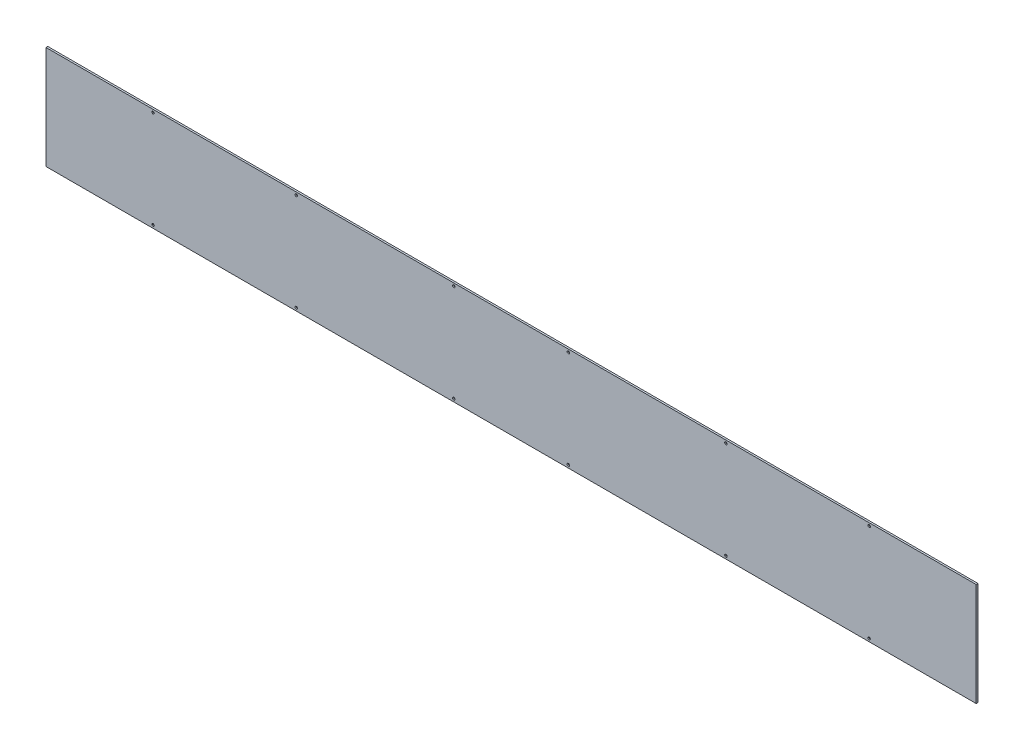
ISO-10303-21;
HEADER;
FILE_DESCRIPTION(('STEP AP214'),'2;1');
FILE_NAME('part.step','',(''),(''),'','','');
FILE_SCHEMA(('AUTOMOTIVE_DESIGN { 1 0 10303 214 1 1 1 1 }'));
ENDSEC;
DATA;
#1=APPLICATION_CONTEXT('core data for automotive mechanical design processes');
#2=APPLICATION_PROTOCOL_DEFINITION('international standard','automotive_design',2000,#1);
#3=PRODUCT_CONTEXT('',#1,'mechanical');
#4=PRODUCT('Part','Part','',(#3));
#5=PRODUCT_RELATED_PRODUCT_CATEGORY('part','',(#4));
#6=PRODUCT_DEFINITION_FORMATION('','',#4);
#7=PRODUCT_DEFINITION_CONTEXT('part definition',#1,'design');
#8=PRODUCT_DEFINITION('design','',#6,#7);
#9=PRODUCT_DEFINITION_SHAPE('','',#8);
#10=(LENGTH_UNIT() NAMED_UNIT(*) SI_UNIT(.MILLI.,.METRE.));
#11=(NAMED_UNIT(*) PLANE_ANGLE_UNIT() SI_UNIT($,.RADIAN.));
#12=(NAMED_UNIT(*) SI_UNIT($,.STERADIAN.) SOLID_ANGLE_UNIT());
#13=UNCERTAINTY_MEASURE_WITH_UNIT(LENGTH_MEASURE(1.E-05),#10,'distance_accuracy_value','');
#14=(GEOMETRIC_REPRESENTATION_CONTEXT(3) GLOBAL_UNCERTAINTY_ASSIGNED_CONTEXT((#13)) GLOBAL_UNIT_ASSIGNED_CONTEXT((#10,
#11,#12)) REPRESENTATION_CONTEXT('',''));
#15=CARTESIAN_POINT('',(0.,0.,0.));
#16=DIRECTION('',(0.,0.,1.));
#17=DIRECTION('',(1.,0.,0.));
#18=AXIS2_PLACEMENT_3D('',#15,#16,#17);
#19=CARTESIAN_POINT('',(-3247.5,0.,12.7));
#20=DIRECTION('',(1.,0.,0.));
#21=DIRECTION('',(0.,0.,-1.));
#22=AXIS2_PLACEMENT_3D('',#19,#20,#21);
#23=PLANE('',#22);
#24=DIRECTION('',(0.,-1.,0.));
#25=VECTOR('',#24,1.);
#26=CARTESIAN_POINT('',(-3247.5,0.,0.));
#27=LINE('',#26,#25);
#28=CARTESIAN_POINT('',(-3247.5,360.,0.));
#29=VERTEX_POINT('',#28);
#30=CARTESIAN_POINT('',(-3247.5,-360.,0.));
#31=VERTEX_POINT('',#30);
#32=EDGE_CURVE('E101',#29,#31,#27,.T.);
#33=ORIENTED_EDGE('',*,*,#32,.T.);
#34=DIRECTION('',(0.,0.,-1.));
#35=VECTOR('',#34,1.);
#36=CARTESIAN_POINT('',(-3247.5,-360.,12.7));
#37=LINE('',#36,#35);
#38=CARTESIAN_POINT('',(-3247.5,-360.,12.7));
#39=VERTEX_POINT('',#38);
#40=EDGE_CURVE('E11',#39,#31,#37,.T.);
#41=ORIENTED_EDGE('',*,*,#40,.F.);
#42=DIRECTION('',(0.,-1.,0.));
#43=VECTOR('',#42,1.);
#44=CARTESIAN_POINT('',(-3247.5,0.,12.7));
#45=LINE('',#44,#43);
#46=CARTESIAN_POINT('',(-3247.5,360.,12.7));
#47=VERTEX_POINT('',#46);
#48=EDGE_CURVE('E88',#47,#39,#45,.T.);
#49=ORIENTED_EDGE('',*,*,#48,.F.);
#50=DIRECTION('',(0.,0.,-1.));
#51=VECTOR('',#50,1.);
#52=CARTESIAN_POINT('',(-3247.5,360.,12.7));
#53=LINE('',#52,#51);
#54=EDGE_CURVE('E97',#47,#29,#53,.T.);
#55=ORIENTED_EDGE('',*,*,#54,.T.);
#56=EDGE_LOOP('',(#33,#41,#49,#55));
#57=FACE_BOUND('',#56,.T.);
#58=ADVANCED_FACE('F35',(#57),#23,.F.);
#59=CARTESIAN_POINT('',(0.,-360.,12.7));
#60=DIRECTION('',(0.,1.,0.));
#61=DIRECTION('',(-1.,0.,0.));
#62=AXIS2_PLACEMENT_3D('',#59,#60,#61);
#63=PLANE('',#62);
#64=DIRECTION('',(1.,0.,0.));
#65=VECTOR('',#64,1.);
#66=CARTESIAN_POINT('',(0.,-360.,0.));
#67=LINE('',#66,#65);
#68=CARTESIAN_POINT('',(3247.5,-359.999999999999,0.));
#69=VERTEX_POINT('',#68);
#70=EDGE_CURVE('E92',#31,#69,#67,.T.);
#71=ORIENTED_EDGE('',*,*,#70,.T.);
#72=DIRECTION('',(0.,0.,-1.));
#73=VECTOR('',#72,1.);
#74=CARTESIAN_POINT('',(3247.5,-359.999999999999,12.7));
#75=LINE('',#74,#73);
#76=CARTESIAN_POINT('',(3247.5,-359.999999999999,12.7));
#77=VERTEX_POINT('',#76);
#78=EDGE_CURVE('E44',#77,#69,#75,.T.);
#79=ORIENTED_EDGE('',*,*,#78,.F.);
#80=DIRECTION('',(1.,0.,0.));
#81=VECTOR('',#80,1.);
#82=CARTESIAN_POINT('',(0.,-360.,12.7));
#83=LINE('',#82,#81);
#84=EDGE_CURVE('E83',#39,#77,#83,.T.);
#85=ORIENTED_EDGE('',*,*,#84,.F.);
#86=ORIENTED_EDGE('',*,*,#40,.T.);
#87=EDGE_LOOP('',(#71,#79,#85,#86));
#88=FACE_BOUND('',#87,.T.);
#89=ADVANCED_FACE('F91',(#88),#63,.F.);
#90=CARTESIAN_POINT('',(3247.5,0.,12.7));
#91=DIRECTION('',(-1.,0.,0.));
#92=DIRECTION('',(0.,0.,1.));
#93=AXIS2_PLACEMENT_3D('',#90,#91,#92);
#94=PLANE('',#93);
#95=DIRECTION('',(0.,1.,0.));
#96=VECTOR('',#95,1.);
#97=CARTESIAN_POINT('',(3247.5,0.,0.));
#98=LINE('',#97,#96);
#99=CARTESIAN_POINT('',(3247.5,359.999999999999,0.));
#100=VERTEX_POINT('',#99);
#101=EDGE_CURVE('E70',#69,#100,#98,.T.);
#102=ORIENTED_EDGE('',*,*,#101,.T.);
#103=DIRECTION('',(0.,0.,-1.));
#104=VECTOR('',#103,1.);
#105=CARTESIAN_POINT('',(3247.5,359.999999999999,12.7));
#106=LINE('',#105,#104);
#107=CARTESIAN_POINT('',(3247.5,359.999999999999,12.7));
#108=VERTEX_POINT('',#107);
#109=EDGE_CURVE('E93',#108,#100,#106,.T.);
#110=ORIENTED_EDGE('',*,*,#109,.F.);
#111=DIRECTION('',(0.,1.,0.));
#112=VECTOR('',#111,1.);
#113=CARTESIAN_POINT('',(3247.5,0.,12.7));
#114=LINE('',#113,#112);
#115=EDGE_CURVE('E86',#77,#108,#114,.T.);
#116=ORIENTED_EDGE('',*,*,#115,.F.);
#117=ORIENTED_EDGE('',*,*,#78,.T.);
#118=EDGE_LOOP('',(#102,#110,#116,#117));
#119=FACE_BOUND('',#118,.T.);
#120=ADVANCED_FACE('F95',(#119),#94,.F.);
#121=CARTESIAN_POINT('',(0.,360.,12.7));
#122=DIRECTION('',(0.,-1.,0.));
#123=DIRECTION('',(1.,0.,0.));
#124=AXIS2_PLACEMENT_3D('',#121,#122,#123);
#125=PLANE('',#124);
#126=DIRECTION('',(-1.,0.,0.));
#127=VECTOR('',#126,1.);
#128=CARTESIAN_POINT('',(0.,360.,0.));
#129=LINE('',#128,#127);
#130=EDGE_CURVE('E76',#100,#29,#129,.T.);
#131=ORIENTED_EDGE('',*,*,#130,.T.);
#132=ORIENTED_EDGE('',*,*,#54,.F.);
#133=DIRECTION('',(-1.,0.,0.));
#134=VECTOR('',#133,1.);
#135=CARTESIAN_POINT('',(0.,360.,12.7));
#136=LINE('',#135,#134);
#137=EDGE_CURVE('E53',#108,#47,#136,.T.);
#138=ORIENTED_EDGE('',*,*,#137,.F.);
#139=ORIENTED_EDGE('',*,*,#109,.T.);
#140=EDGE_LOOP('',(#131,#132,#138,#139));
#141=FACE_BOUND('',#140,.T.);
#142=ADVANCED_FACE('F225',(#141),#125,.F.);
#143=CARTESIAN_POINT('',(0.,0.,12.7));
#144=DIRECTION('',(0.,0.,1.));
#145=DIRECTION('',(1.,0.,0.));
#146=AXIS2_PLACEMENT_3D('',#143,#144,#145);
#147=PLANE('',#146);
#148=CARTESIAN_POINT('',(-2500.,339.999999999999,12.7));
#149=DIRECTION('',(0.,0.,1.));
#150=DIRECTION('',(1.,0.,0.));
#151=AXIS2_PLACEMENT_3D('',#148,#149,#150);
#152=CIRCLE('',#151,8.64999999999982);
#153=CARTESIAN_POINT('',(-2491.35,339.999999999999,12.7));
#154=VERTEX_POINT('',#153);
#155=EDGE_CURVE('E503',#154,#154,#152,.T.);
#156=ORIENTED_EDGE('',*,*,#155,.F.);
#157=EDGE_LOOP('',(#156));
#158=FACE_BOUND('',#157,.T.);
#159=CARTESIAN_POINT('',(-1500.,339.999999999999,12.7));
#160=DIRECTION('',(0.,0.,1.));
#161=DIRECTION('',(1.,0.,0.));
#162=AXIS2_PLACEMENT_3D('',#159,#160,#161);
#163=CIRCLE('',#162,8.65000000000005);
#164=CARTESIAN_POINT('',(-1491.35,339.999999999999,12.7));
#165=VERTEX_POINT('',#164);
#166=EDGE_CURVE('E166',#165,#165,#163,.T.);
#167=ORIENTED_EDGE('',*,*,#166,.F.);
#168=EDGE_LOOP('',(#167));
#169=FACE_BOUND('',#168,.T.);
#170=CARTESIAN_POINT('',(400.,339.999999999999,12.7));
#171=DIRECTION('',(0.,0.,1.));
#172=DIRECTION('',(1.,0.,0.));
#173=AXIS2_PLACEMENT_3D('',#170,#171,#172);
#174=CIRCLE('',#173,8.64999999999999);
#175=CARTESIAN_POINT('',(408.65,339.999999999999,12.7));
#176=VERTEX_POINT('',#175);
#177=EDGE_CURVE('E159',#176,#176,#174,.T.);
#178=ORIENTED_EDGE('',*,*,#177,.F.);
#179=EDGE_LOOP('',(#178));
#180=FACE_BOUND('',#179,.T.);
#181=CARTESIAN_POINT('',(1500.,339.999999999999,12.7));
#182=DIRECTION('',(0.,0.,1.));
#183=DIRECTION('',(1.,0.,0.));
#184=AXIS2_PLACEMENT_3D('',#181,#182,#183);
#185=CIRCLE('',#184,8.65000000000005);
#186=CARTESIAN_POINT('',(1508.65,339.999999999999,12.7));
#187=VERTEX_POINT('',#186);
#188=EDGE_CURVE('E155',#187,#187,#185,.T.);
#189=ORIENTED_EDGE('',*,*,#188,.F.);
#190=EDGE_LOOP('',(#189));
#191=FACE_BOUND('',#190,.T.);
#192=CARTESIAN_POINT('',(2500.,339.999999999999,12.7));
#193=DIRECTION('',(0.,0.,1.));
#194=DIRECTION('',(1.,0.,0.));
#195=AXIS2_PLACEMENT_3D('',#192,#193,#194);
#196=CIRCLE('',#195,8.64999999999982);
#197=CARTESIAN_POINT('',(2508.65,339.999999999999,12.7));
#198=VERTEX_POINT('',#197);
#199=EDGE_CURVE('E151',#198,#198,#196,.T.);
#200=ORIENTED_EDGE('',*,*,#199,.F.);
#201=EDGE_LOOP('',(#200));
#202=FACE_BOUND('',#201,.T.);
#203=CARTESIAN_POINT('',(2500.,-340.,12.7));
#204=DIRECTION('',(0.,0.,1.));
#205=DIRECTION('',(1.,0.,0.));
#206=AXIS2_PLACEMENT_3D('',#203,#204,#205);
#207=CIRCLE('',#206,8.64999999999982);
#208=CARTESIAN_POINT('',(2508.65,-340.,12.7));
#209=VERTEX_POINT('',#208);
#210=EDGE_CURVE('E146',#209,#209,#207,.T.);
#211=ORIENTED_EDGE('',*,*,#210,.F.);
#212=EDGE_LOOP('',(#211));
#213=FACE_BOUND('',#212,.T.);
#214=CARTESIAN_POINT('',(1500.,-340.,12.7));
#215=DIRECTION('',(0.,0.,1.));
#216=DIRECTION('',(1.,0.,0.));
#217=AXIS2_PLACEMENT_3D('',#214,#215,#216);
#218=CIRCLE('',#217,8.65000000000005);
#219=CARTESIAN_POINT('',(1508.65,-340.,12.7));
#220=VERTEX_POINT('',#219);
#221=EDGE_CURVE('E141',#220,#220,#218,.T.);
#222=ORIENTED_EDGE('',*,*,#221,.F.);
#223=EDGE_LOOP('',(#222));
#224=FACE_BOUND('',#223,.T.);
#225=CARTESIAN_POINT('',(400.,-340.,12.7));
#226=DIRECTION('',(0.,0.,1.));
#227=DIRECTION('',(1.,0.,0.));
#228=AXIS2_PLACEMENT_3D('',#225,#226,#227);
#229=CIRCLE('',#228,8.64999999999999);
#230=CARTESIAN_POINT('',(408.65,-340.,12.7));
#231=VERTEX_POINT('',#230);
#232=EDGE_CURVE('E136',#231,#231,#229,.T.);
#233=ORIENTED_EDGE('',*,*,#232,.F.);
#234=EDGE_LOOP('',(#233));
#235=FACE_BOUND('',#234,.T.);
#236=CARTESIAN_POINT('',(-1500.,-340.,12.7));
#237=DIRECTION('',(0.,0.,1.));
#238=DIRECTION('',(1.,0.,0.));
#239=AXIS2_PLACEMENT_3D('',#236,#237,#238);
#240=CIRCLE('',#239,8.65000000000005);
#241=CARTESIAN_POINT('',(-1491.35,-340.,12.7));
#242=VERTEX_POINT('',#241);
#243=EDGE_CURVE('E131',#242,#242,#240,.T.);
#244=ORIENTED_EDGE('',*,*,#243,.F.);
#245=EDGE_LOOP('',(#244));
#246=FACE_BOUND('',#245,.T.);
#247=CARTESIAN_POINT('',(-2500.,-340.,12.7));
#248=DIRECTION('',(0.,0.,1.));
#249=DIRECTION('',(1.,0.,0.));
#250=AXIS2_PLACEMENT_3D('',#247,#248,#249);
#251=CIRCLE('',#250,8.64999999999982);
#252=CARTESIAN_POINT('',(-2491.35,-340.,12.7));
#253=VERTEX_POINT('',#252);
#254=EDGE_CURVE('E126',#253,#253,#251,.T.);
#255=ORIENTED_EDGE('',*,*,#254,.F.);
#256=EDGE_LOOP('',(#255));
#257=FACE_BOUND('',#256,.T.);
#258=CARTESIAN_POINT('',(-400.,339.999999999999,12.7));
#259=DIRECTION('',(0.,0.,1.));
#260=DIRECTION('',(1.,0.,0.));
#261=AXIS2_PLACEMENT_3D('',#258,#259,#260);
#262=CIRCLE('',#261,8.64999999999999);
#263=CARTESIAN_POINT('',(-391.35,339.999999999999,12.7));
#264=VERTEX_POINT('',#263);
#265=EDGE_CURVE('E121',#264,#264,#262,.T.);
#266=ORIENTED_EDGE('',*,*,#265,.F.);
#267=EDGE_LOOP('',(#266));
#268=FACE_BOUND('',#267,.T.);
#269=CARTESIAN_POINT('',(-400.,-340.,12.7));
#270=DIRECTION('',(0.,0.,1.));
#271=DIRECTION('',(1.,0.,0.));
#272=AXIS2_PLACEMENT_3D('',#269,#270,#271);
#273=CIRCLE('',#272,8.64999999999999);
#274=CARTESIAN_POINT('',(-391.35,-340.,12.7));
#275=VERTEX_POINT('',#274);
#276=EDGE_CURVE('E116',#275,#275,#273,.T.);
#277=ORIENTED_EDGE('',*,*,#276,.F.);
#278=EDGE_LOOP('',(#277));
#279=FACE_BOUND('',#278,.T.);
#280=ORIENTED_EDGE('',*,*,#48,.T.);
#281=ORIENTED_EDGE('',*,*,#84,.T.);
#282=ORIENTED_EDGE('',*,*,#115,.T.);
#283=ORIENTED_EDGE('',*,*,#137,.T.);
#284=EDGE_LOOP('',(#280,#281,#282,#283));
#285=FACE_BOUND('',#284,.T.);
#286=ADVANCED_FACE('F84',(#158,#169,#180,#191,#202,#213,#224,#235,#246,#257,#268,#279,#285),
#147,.T.);
#287=CARTESIAN_POINT('',(0.,0.,0.));
#288=DIRECTION('',(0.,0.,1.));
#289=DIRECTION('',(1.,0.,0.));
#290=AXIS2_PLACEMENT_3D('',#287,#288,#289);
#291=PLANE('',#290);
#292=CARTESIAN_POINT('',(-2500.,339.999999999999,0.));
#293=DIRECTION('',(0.,0.,1.));
#294=DIRECTION('',(1.,0.,0.));
#295=AXIS2_PLACEMENT_3D('',#292,#293,#294);
#296=CIRCLE('',#295,4.19999999999998);
#297=CARTESIAN_POINT('',(-2495.8,339.999999999999,0.));
#298=VERTEX_POINT('',#297);
#299=EDGE_CURVE('E38',#298,#298,#296,.T.);
#300=ORIENTED_EDGE('',*,*,#299,.T.);
#301=EDGE_LOOP('',(#300));
#302=FACE_BOUND('',#301,.T.);
#303=CARTESIAN_POINT('',(-1500.,339.999999999999,0.));
#304=DIRECTION('',(0.,0.,1.));
#305=DIRECTION('',(1.,0.,0.));
#306=AXIS2_PLACEMENT_3D('',#303,#304,#305);
#307=CIRCLE('',#306,4.19999999999998);
#308=CARTESIAN_POINT('',(-1495.8,339.999999999999,0.));
#309=VERTEX_POINT('',#308);
#310=EDGE_CURVE('E157',#309,#309,#307,.T.);
#311=ORIENTED_EDGE('',*,*,#310,.T.);
#312=EDGE_LOOP('',(#311));
#313=FACE_BOUND('',#312,.T.);
#314=CARTESIAN_POINT('',(400.,339.999999999999,0.));
#315=DIRECTION('',(0.,0.,1.));
#316=DIRECTION('',(1.,0.,0.));
#317=AXIS2_PLACEMENT_3D('',#314,#315,#316);
#318=CIRCLE('',#317,4.19999999999998);
#319=CARTESIAN_POINT('',(404.2,339.999999999999,0.));
#320=VERTEX_POINT('',#319);
#321=EDGE_CURVE('E153',#320,#320,#318,.T.);
#322=ORIENTED_EDGE('',*,*,#321,.T.);
#323=EDGE_LOOP('',(#322));
#324=FACE_BOUND('',#323,.T.);
#325=CARTESIAN_POINT('',(1500.,339.999999999999,0.));
#326=DIRECTION('',(0.,0.,1.));
#327=DIRECTION('',(1.,0.,0.));
#328=AXIS2_PLACEMENT_3D('',#325,#326,#327);
#329=CIRCLE('',#328,4.19999999999998);
#330=CARTESIAN_POINT('',(1504.2,339.999999999999,0.));
#331=VERTEX_POINT('',#330);
#332=EDGE_CURVE('E148',#331,#331,#329,.T.);
#333=ORIENTED_EDGE('',*,*,#332,.T.);
#334=EDGE_LOOP('',(#333));
#335=FACE_BOUND('',#334,.T.);
#336=CARTESIAN_POINT('',(2500.,339.999999999999,0.));
#337=DIRECTION('',(0.,0.,1.));
#338=DIRECTION('',(1.,0.,0.));
#339=AXIS2_PLACEMENT_3D('',#336,#337,#338);
#340=CIRCLE('',#339,4.19999999999998);
#341=CARTESIAN_POINT('',(2504.2,339.999999999999,0.));
#342=VERTEX_POINT('',#341);
#343=EDGE_CURVE('E143',#342,#342,#340,.T.);
#344=ORIENTED_EDGE('',*,*,#343,.T.);
#345=EDGE_LOOP('',(#344));
#346=FACE_BOUND('',#345,.T.);
#347=CARTESIAN_POINT('',(2500.,-340.,0.));
#348=DIRECTION('',(0.,0.,1.));
#349=DIRECTION('',(1.,0.,0.));
#350=AXIS2_PLACEMENT_3D('',#347,#348,#349);
#351=CIRCLE('',#350,4.19999999999998);
#352=CARTESIAN_POINT('',(2504.2,-340.,0.));
#353=VERTEX_POINT('',#352);
#354=EDGE_CURVE('E138',#353,#353,#351,.T.);
#355=ORIENTED_EDGE('',*,*,#354,.T.);
#356=EDGE_LOOP('',(#355));
#357=FACE_BOUND('',#356,.T.);
#358=CARTESIAN_POINT('',(1500.,-340.,0.));
#359=DIRECTION('',(0.,0.,1.));
#360=DIRECTION('',(1.,0.,0.));
#361=AXIS2_PLACEMENT_3D('',#358,#359,#360);
#362=CIRCLE('',#361,4.19999999999998);
#363=CARTESIAN_POINT('',(1504.2,-340.,0.));
#364=VERTEX_POINT('',#363);
#365=EDGE_CURVE('E133',#364,#364,#362,.T.);
#366=ORIENTED_EDGE('',*,*,#365,.T.);
#367=EDGE_LOOP('',(#366));
#368=FACE_BOUND('',#367,.T.);
#369=CARTESIAN_POINT('',(400.,-340.,0.));
#370=DIRECTION('',(0.,0.,1.));
#371=DIRECTION('',(1.,0.,0.));
#372=AXIS2_PLACEMENT_3D('',#369,#370,#371);
#373=CIRCLE('',#372,4.19999999999998);
#374=CARTESIAN_POINT('',(404.2,-340.,0.));
#375=VERTEX_POINT('',#374);
#376=EDGE_CURVE('E128',#375,#375,#373,.T.);
#377=ORIENTED_EDGE('',*,*,#376,.T.);
#378=EDGE_LOOP('',(#377));
#379=FACE_BOUND('',#378,.T.);
#380=CARTESIAN_POINT('',(-1500.,-340.,0.));
#381=DIRECTION('',(0.,0.,1.));
#382=DIRECTION('',(1.,0.,0.));
#383=AXIS2_PLACEMENT_3D('',#380,#381,#382);
#384=CIRCLE('',#383,4.19999999999998);
#385=CARTESIAN_POINT('',(-1495.8,-340.,0.));
#386=VERTEX_POINT('',#385);
#387=EDGE_CURVE('E123',#386,#386,#384,.T.);
#388=ORIENTED_EDGE('',*,*,#387,.T.);
#389=EDGE_LOOP('',(#388));
#390=FACE_BOUND('',#389,.T.);
#391=CARTESIAN_POINT('',(-2500.,-340.,0.));
#392=DIRECTION('',(0.,0.,1.));
#393=DIRECTION('',(1.,0.,0.));
#394=AXIS2_PLACEMENT_3D('',#391,#392,#393);
#395=CIRCLE('',#394,4.19999999999998);
#396=CARTESIAN_POINT('',(-2495.8,-340.,0.));
#397=VERTEX_POINT('',#396);
#398=EDGE_CURVE('E118',#397,#397,#395,.T.);
#399=ORIENTED_EDGE('',*,*,#398,.T.);
#400=EDGE_LOOP('',(#399));
#401=FACE_BOUND('',#400,.T.);
#402=CARTESIAN_POINT('',(-400.,339.999999999999,0.));
#403=DIRECTION('',(0.,0.,1.));
#404=DIRECTION('',(1.,0.,0.));
#405=AXIS2_PLACEMENT_3D('',#402,#403,#404);
#406=CIRCLE('',#405,4.19999999999998);
#407=CARTESIAN_POINT('',(-395.8,339.999999999999,0.));
#408=VERTEX_POINT('',#407);
#409=EDGE_CURVE('E113',#408,#408,#406,.T.);
#410=ORIENTED_EDGE('',*,*,#409,.T.);
#411=EDGE_LOOP('',(#410));
#412=FACE_BOUND('',#411,.T.);
#413=CARTESIAN_POINT('',(-400.,-340.,0.));
#414=DIRECTION('',(0.,0.,1.));
#415=DIRECTION('',(1.,0.,0.));
#416=AXIS2_PLACEMENT_3D('',#413,#414,#415);
#417=CIRCLE('',#416,4.19999999999998);
#418=CARTESIAN_POINT('',(-395.8,-340.,0.));
#419=VERTEX_POINT('',#418);
#420=EDGE_CURVE('E104',#419,#419,#417,.T.);
#421=ORIENTED_EDGE('',*,*,#420,.T.);
#422=EDGE_LOOP('',(#421));
#423=FACE_BOUND('',#422,.T.);
#424=ORIENTED_EDGE('',*,*,#32,.F.);
#425=ORIENTED_EDGE('',*,*,#130,.F.);
#426=ORIENTED_EDGE('',*,*,#101,.F.);
#427=ORIENTED_EDGE('',*,*,#70,.F.);
#428=EDGE_LOOP('',(#424,#425,#426,#427));
#429=FACE_BOUND('',#428,.T.);
#430=ADVANCED_FACE('F224',(#302,#313,#324,#335,#346,#357,#368,#379,#390,#401,#412,#423,#429),
#291,.F.);
#431=CARTESIAN_POINT('',(-400.,-340.,12.7));
#432=DIRECTION('',(0.,0.,1.));
#433=DIRECTION('',(1.,0.,0.));
#434=AXIS2_PLACEMENT_3D('',#431,#432,#433);
#435=CYLINDRICAL_SURFACE('',#434,4.19999999999998);
#436=CARTESIAN_POINT('',(-400.,-340.,8.25));
#437=DIRECTION('',(0.,0.,1.));
#438=DIRECTION('',(1.,0.,0.));
#439=AXIS2_PLACEMENT_3D('',#436,#437,#438);
#440=CIRCLE('',#439,4.19999999999998);
#441=CARTESIAN_POINT('',(-395.8,-340.,8.25));
#442=VERTEX_POINT('',#441);
#443=EDGE_CURVE('E112',#442,#442,#440,.T.);
#444=ORIENTED_EDGE('',*,*,#443,.T.);
#445=EDGE_LOOP('',(#444));
#446=FACE_BOUND('',#445,.T.);
#447=ORIENTED_EDGE('',*,*,#420,.F.);
#448=EDGE_LOOP('',(#447));
#449=FACE_BOUND('',#448,.T.);
#450=ADVANCED_FACE('F213',(#446,#449),#435,.F.);
#451=CARTESIAN_POINT('',(-400.,-340.,12.7));
#452=DIRECTION('',(0.,0.,1.));
#453=DIRECTION('',(1.,0.,0.));
#454=AXIS2_PLACEMENT_3D('',#451,#452,#453);
#455=CONICAL_SURFACE('',#454,8.64999999999999,0.785398163397449);
#456=ORIENTED_EDGE('',*,*,#443,.F.);
#457=EDGE_LOOP('',(#456));
#458=FACE_BOUND('',#457,.T.);
#459=ORIENTED_EDGE('',*,*,#276,.T.);
#460=EDGE_LOOP('',(#459));
#461=FACE_BOUND('',#460,.T.);
#462=ADVANCED_FACE('F216',(#458,#461),#455,.F.);
#463=CARTESIAN_POINT('',(-400.,339.999999999999,12.7));
#464=DIRECTION('',(0.,0.,1.));
#465=DIRECTION('',(1.,0.,0.));
#466=AXIS2_PLACEMENT_3D('',#463,#464,#465);
#467=CYLINDRICAL_SURFACE('',#466,4.19999999999998);
#468=CARTESIAN_POINT('',(-400.,339.999999999999,8.25));
#469=DIRECTION('',(0.,0.,1.));
#470=DIRECTION('',(1.,0.,0.));
#471=AXIS2_PLACEMENT_3D('',#468,#469,#470);
#472=CIRCLE('',#471,4.19999999999998);
#473=CARTESIAN_POINT('',(-395.8,339.999999999999,8.25));
#474=VERTEX_POINT('',#473);
#475=EDGE_CURVE('E117',#474,#474,#472,.T.);
#476=ORIENTED_EDGE('',*,*,#475,.T.);
#477=EDGE_LOOP('',(#476));
#478=FACE_BOUND('',#477,.T.);
#479=ORIENTED_EDGE('',*,*,#409,.F.);
#480=EDGE_LOOP('',(#479));
#481=FACE_BOUND('',#480,.T.);
#482=ADVANCED_FACE('F219',(#478,#481),#467,.F.);
#483=CARTESIAN_POINT('',(-400.,339.999999999999,12.7));
#484=DIRECTION('',(0.,0.,1.));
#485=DIRECTION('',(1.,0.,0.));
#486=AXIS2_PLACEMENT_3D('',#483,#484,#485);
#487=CONICAL_SURFACE('',#486,8.64999999999999,0.785398163397449);
#488=ORIENTED_EDGE('',*,*,#475,.F.);
#489=EDGE_LOOP('',(#488));
#490=FACE_BOUND('',#489,.T.);
#491=ORIENTED_EDGE('',*,*,#265,.T.);
#492=EDGE_LOOP('',(#491));
#493=FACE_BOUND('',#492,.T.);
#494=ADVANCED_FACE('F280',(#490,#493),#487,.F.);
#495=CARTESIAN_POINT('',(-2500.,-340.,12.7));
#496=DIRECTION('',(0.,0.,1.));
#497=DIRECTION('',(1.,0.,0.));
#498=AXIS2_PLACEMENT_3D('',#495,#496,#497);
#499=CYLINDRICAL_SURFACE('',#498,4.19999999999998);
#500=CARTESIAN_POINT('',(-2500.,-340.,8.25));
#501=DIRECTION('',(0.,0.,1.));
#502=DIRECTION('',(1.,0.,0.));
#503=AXIS2_PLACEMENT_3D('',#500,#501,#502);
#504=CIRCLE('',#503,4.19999999999998);
#505=CARTESIAN_POINT('',(-2495.8,-340.,8.25));
#506=VERTEX_POINT('',#505);
#507=EDGE_CURVE('E122',#506,#506,#504,.T.);
#508=ORIENTED_EDGE('',*,*,#507,.T.);
#509=EDGE_LOOP('',(#508));
#510=FACE_BOUND('',#509,.T.);
#511=ORIENTED_EDGE('',*,*,#398,.F.);
#512=EDGE_LOOP('',(#511));
#513=FACE_BOUND('',#512,.T.);
#514=ADVANCED_FACE('F288',(#510,#513),#499,.F.);
#515=CARTESIAN_POINT('',(-2500.,-340.,12.7));
#516=DIRECTION('',(0.,0.,1.));
#517=DIRECTION('',(1.,0.,0.));
#518=AXIS2_PLACEMENT_3D('',#515,#516,#517);
#519=CONICAL_SURFACE('',#518,8.64999999999982,0.785398163397431);
#520=ORIENTED_EDGE('',*,*,#507,.F.);
#521=EDGE_LOOP('',(#520));
#522=FACE_BOUND('',#521,.T.);
#523=ORIENTED_EDGE('',*,*,#254,.T.);
#524=EDGE_LOOP('',(#523));
#525=FACE_BOUND('',#524,.T.);
#526=ADVANCED_FACE('F296',(#522,#525),#519,.F.);
#527=CARTESIAN_POINT('',(-1500.,-340.,12.7));
#528=DIRECTION('',(0.,0.,1.));
#529=DIRECTION('',(1.,0.,0.));
#530=AXIS2_PLACEMENT_3D('',#527,#528,#529);
#531=CYLINDRICAL_SURFACE('',#530,4.19999999999998);
#532=CARTESIAN_POINT('',(-1500.,-340.,8.25));
#533=DIRECTION('',(0.,0.,1.));
#534=DIRECTION('',(1.,0.,0.));
#535=AXIS2_PLACEMENT_3D('',#532,#533,#534);
#536=CIRCLE('',#535,4.19999999999998);
#537=CARTESIAN_POINT('',(-1495.8,-340.,8.25));
#538=VERTEX_POINT('',#537);
#539=EDGE_CURVE('E127',#538,#538,#536,.T.);
#540=ORIENTED_EDGE('',*,*,#539,.T.);
#541=EDGE_LOOP('',(#540));
#542=FACE_BOUND('',#541,.T.);
#543=ORIENTED_EDGE('',*,*,#387,.F.);
#544=EDGE_LOOP('',(#543));
#545=FACE_BOUND('',#544,.T.);
#546=ADVANCED_FACE('F304',(#542,#545),#531,.F.);
#547=CARTESIAN_POINT('',(-1500.,-340.,12.7));
#548=DIRECTION('',(0.,0.,1.));
#549=DIRECTION('',(1.,0.,0.));
#550=AXIS2_PLACEMENT_3D('',#547,#548,#549);
#551=CONICAL_SURFACE('',#550,8.65000000000005,0.785398163397455);
#552=ORIENTED_EDGE('',*,*,#539,.F.);
#553=EDGE_LOOP('',(#552));
#554=FACE_BOUND('',#553,.T.);
#555=ORIENTED_EDGE('',*,*,#243,.T.);
#556=EDGE_LOOP('',(#555));
#557=FACE_BOUND('',#556,.T.);
#558=ADVANCED_FACE('F312',(#554,#557),#551,.F.);
#559=CARTESIAN_POINT('',(400.,-340.,12.7));
#560=DIRECTION('',(0.,0.,1.));
#561=DIRECTION('',(1.,0.,0.));
#562=AXIS2_PLACEMENT_3D('',#559,#560,#561);
#563=CYLINDRICAL_SURFACE('',#562,4.19999999999998);
#564=CARTESIAN_POINT('',(400.,-340.,8.25));
#565=DIRECTION('',(0.,0.,1.));
#566=DIRECTION('',(1.,0.,0.));
#567=AXIS2_PLACEMENT_3D('',#564,#565,#566);
#568=CIRCLE('',#567,4.19999999999998);
#569=CARTESIAN_POINT('',(404.2,-340.,8.25));
#570=VERTEX_POINT('',#569);
#571=EDGE_CURVE('E132',#570,#570,#568,.T.);
#572=ORIENTED_EDGE('',*,*,#571,.T.);
#573=EDGE_LOOP('',(#572));
#574=FACE_BOUND('',#573,.T.);
#575=ORIENTED_EDGE('',*,*,#376,.F.);
#576=EDGE_LOOP('',(#575));
#577=FACE_BOUND('',#576,.T.);
#578=ADVANCED_FACE('F320',(#574,#577),#563,.F.);
#579=CARTESIAN_POINT('',(400.,-340.,12.7));
#580=DIRECTION('',(0.,0.,1.));
#581=DIRECTION('',(1.,0.,0.));
#582=AXIS2_PLACEMENT_3D('',#579,#580,#581);
#583=CONICAL_SURFACE('',#582,8.64999999999999,0.785398163397449);
#584=ORIENTED_EDGE('',*,*,#571,.F.);
#585=EDGE_LOOP('',(#584));
#586=FACE_BOUND('',#585,.T.);
#587=ORIENTED_EDGE('',*,*,#232,.T.);
#588=EDGE_LOOP('',(#587));
#589=FACE_BOUND('',#588,.T.);
#590=ADVANCED_FACE('F328',(#586,#589),#583,.F.);
#591=CARTESIAN_POINT('',(1500.,-340.,12.7));
#592=DIRECTION('',(0.,0.,1.));
#593=DIRECTION('',(1.,0.,0.));
#594=AXIS2_PLACEMENT_3D('',#591,#592,#593);
#595=CYLINDRICAL_SURFACE('',#594,4.19999999999998);
#596=CARTESIAN_POINT('',(1500.,-340.,8.25));
#597=DIRECTION('',(0.,0.,1.));
#598=DIRECTION('',(1.,0.,0.));
#599=AXIS2_PLACEMENT_3D('',#596,#597,#598);
#600=CIRCLE('',#599,4.19999999999998);
#601=CARTESIAN_POINT('',(1504.2,-340.,8.25));
#602=VERTEX_POINT('',#601);
#603=EDGE_CURVE('E137',#602,#602,#600,.T.);
#604=ORIENTED_EDGE('',*,*,#603,.T.);
#605=EDGE_LOOP('',(#604));
#606=FACE_BOUND('',#605,.T.);
#607=ORIENTED_EDGE('',*,*,#365,.F.);
#608=EDGE_LOOP('',(#607));
#609=FACE_BOUND('',#608,.T.);
#610=ADVANCED_FACE('F336',(#606,#609),#595,.F.);
#611=CARTESIAN_POINT('',(1500.,-340.,12.7));
#612=DIRECTION('',(0.,0.,1.));
#613=DIRECTION('',(1.,0.,0.));
#614=AXIS2_PLACEMENT_3D('',#611,#612,#613);
#615=CONICAL_SURFACE('',#614,8.65000000000005,0.785398163397455);
#616=ORIENTED_EDGE('',*,*,#603,.F.);
#617=EDGE_LOOP('',(#616));
#618=FACE_BOUND('',#617,.T.);
#619=ORIENTED_EDGE('',*,*,#221,.T.);
#620=EDGE_LOOP('',(#619));
#621=FACE_BOUND('',#620,.T.);
#622=ADVANCED_FACE('F344',(#618,#621),#615,.F.);
#623=CARTESIAN_POINT('',(2500.,-340.,12.7));
#624=DIRECTION('',(0.,0.,1.));
#625=DIRECTION('',(1.,0.,0.));
#626=AXIS2_PLACEMENT_3D('',#623,#624,#625);
#627=CYLINDRICAL_SURFACE('',#626,4.19999999999998);
#628=CARTESIAN_POINT('',(2500.,-340.,8.25));
#629=DIRECTION('',(0.,0.,1.));
#630=DIRECTION('',(1.,0.,0.));
#631=AXIS2_PLACEMENT_3D('',#628,#629,#630);
#632=CIRCLE('',#631,4.19999999999998);
#633=CARTESIAN_POINT('',(2504.2,-340.,8.25));
#634=VERTEX_POINT('',#633);
#635=EDGE_CURVE('E142',#634,#634,#632,.T.);
#636=ORIENTED_EDGE('',*,*,#635,.T.);
#637=EDGE_LOOP('',(#636));
#638=FACE_BOUND('',#637,.T.);
#639=ORIENTED_EDGE('',*,*,#354,.F.);
#640=EDGE_LOOP('',(#639));
#641=FACE_BOUND('',#640,.T.);
#642=ADVANCED_FACE('F352',(#638,#641),#627,.F.);
#643=CARTESIAN_POINT('',(2500.,-340.,12.7));
#644=DIRECTION('',(0.,0.,1.));
#645=DIRECTION('',(1.,0.,0.));
#646=AXIS2_PLACEMENT_3D('',#643,#644,#645);
#647=CONICAL_SURFACE('',#646,8.64999999999982,0.785398163397431);
#648=ORIENTED_EDGE('',*,*,#635,.F.);
#649=EDGE_LOOP('',(#648));
#650=FACE_BOUND('',#649,.T.);
#651=ORIENTED_EDGE('',*,*,#210,.T.);
#652=EDGE_LOOP('',(#651));
#653=FACE_BOUND('',#652,.T.);
#654=ADVANCED_FACE('F360',(#650,#653),#647,.F.);
#655=CARTESIAN_POINT('',(2500.,339.999999999999,12.7));
#656=DIRECTION('',(0.,0.,1.));
#657=DIRECTION('',(1.,0.,0.));
#658=AXIS2_PLACEMENT_3D('',#655,#656,#657);
#659=CYLINDRICAL_SURFACE('',#658,4.19999999999998);
#660=CARTESIAN_POINT('',(2500.,339.999999999999,8.25));
#661=DIRECTION('',(0.,0.,1.));
#662=DIRECTION('',(1.,0.,0.));
#663=AXIS2_PLACEMENT_3D('',#660,#661,#662);
#664=CIRCLE('',#663,4.19999999999998);
#665=CARTESIAN_POINT('',(2504.2,339.999999999999,8.25));
#666=VERTEX_POINT('',#665);
#667=EDGE_CURVE('E147',#666,#666,#664,.T.);
#668=ORIENTED_EDGE('',*,*,#667,.T.);
#669=EDGE_LOOP('',(#668));
#670=FACE_BOUND('',#669,.T.);
#671=ORIENTED_EDGE('',*,*,#343,.F.);
#672=EDGE_LOOP('',(#671));
#673=FACE_BOUND('',#672,.T.);
#674=ADVANCED_FACE('F368',(#670,#673),#659,.F.);
#675=CARTESIAN_POINT('',(2500.,339.999999999999,12.7));
#676=DIRECTION('',(0.,0.,1.));
#677=DIRECTION('',(1.,0.,0.));
#678=AXIS2_PLACEMENT_3D('',#675,#676,#677);
#679=CONICAL_SURFACE('',#678,8.64999999999982,0.785398163397431);
#680=ORIENTED_EDGE('',*,*,#667,.F.);
#681=EDGE_LOOP('',(#680));
#682=FACE_BOUND('',#681,.T.);
#683=ORIENTED_EDGE('',*,*,#199,.T.);
#684=EDGE_LOOP('',(#683));
#685=FACE_BOUND('',#684,.T.);
#686=ADVANCED_FACE('F376',(#682,#685),#679,.F.);
#687=CARTESIAN_POINT('',(1500.,339.999999999999,12.7));
#688=DIRECTION('',(0.,0.,1.));
#689=DIRECTION('',(1.,0.,0.));
#690=AXIS2_PLACEMENT_3D('',#687,#688,#689);
#691=CYLINDRICAL_SURFACE('',#690,4.19999999999998);
#692=CARTESIAN_POINT('',(1500.,339.999999999999,8.25));
#693=DIRECTION('',(0.,0.,1.));
#694=DIRECTION('',(1.,0.,0.));
#695=AXIS2_PLACEMENT_3D('',#692,#693,#694);
#696=CIRCLE('',#695,4.19999999999998);
#697=CARTESIAN_POINT('',(1504.2,339.999999999999,8.25));
#698=VERTEX_POINT('',#697);
#699=EDGE_CURVE('E152',#698,#698,#696,.T.);
#700=ORIENTED_EDGE('',*,*,#699,.T.);
#701=EDGE_LOOP('',(#700));
#702=FACE_BOUND('',#701,.T.);
#703=ORIENTED_EDGE('',*,*,#332,.F.);
#704=EDGE_LOOP('',(#703));
#705=FACE_BOUND('',#704,.T.);
#706=ADVANCED_FACE('F384',(#702,#705),#691,.F.);
#707=CARTESIAN_POINT('',(1500.,339.999999999999,12.7));
#708=DIRECTION('',(0.,0.,1.));
#709=DIRECTION('',(1.,0.,0.));
#710=AXIS2_PLACEMENT_3D('',#707,#708,#709);
#711=CONICAL_SURFACE('',#710,8.65000000000005,0.785398163397455);
#712=ORIENTED_EDGE('',*,*,#699,.F.);
#713=EDGE_LOOP('',(#712));
#714=FACE_BOUND('',#713,.T.);
#715=ORIENTED_EDGE('',*,*,#188,.T.);
#716=EDGE_LOOP('',(#715));
#717=FACE_BOUND('',#716,.T.);
#718=ADVANCED_FACE('F392',(#714,#717),#711,.F.);
#719=CARTESIAN_POINT('',(400.,339.999999999999,12.7));
#720=DIRECTION('',(0.,0.,1.));
#721=DIRECTION('',(1.,0.,0.));
#722=AXIS2_PLACEMENT_3D('',#719,#720,#721);
#723=CYLINDRICAL_SURFACE('',#722,4.19999999999998);
#724=CARTESIAN_POINT('',(400.,339.999999999999,8.25));
#725=DIRECTION('',(0.,0.,1.));
#726=DIRECTION('',(1.,0.,0.));
#727=AXIS2_PLACEMENT_3D('',#724,#725,#726);
#728=CIRCLE('',#727,4.19999999999998);
#729=CARTESIAN_POINT('',(404.2,339.999999999999,8.25));
#730=VERTEX_POINT('',#729);
#731=EDGE_CURVE('E156',#730,#730,#728,.T.);
#732=ORIENTED_EDGE('',*,*,#731,.T.);
#733=EDGE_LOOP('',(#732));
#734=FACE_BOUND('',#733,.T.);
#735=ORIENTED_EDGE('',*,*,#321,.F.);
#736=EDGE_LOOP('',(#735));
#737=FACE_BOUND('',#736,.T.);
#738=ADVANCED_FACE('F400',(#734,#737),#723,.F.);
#739=CARTESIAN_POINT('',(400.,339.999999999999,12.7));
#740=DIRECTION('',(0.,0.,1.));
#741=DIRECTION('',(1.,0.,0.));
#742=AXIS2_PLACEMENT_3D('',#739,#740,#741);
#743=CONICAL_SURFACE('',#742,8.64999999999999,0.785398163397449);
#744=ORIENTED_EDGE('',*,*,#731,.F.);
#745=EDGE_LOOP('',(#744));
#746=FACE_BOUND('',#745,.T.);
#747=ORIENTED_EDGE('',*,*,#177,.T.);
#748=EDGE_LOOP('',(#747));
#749=FACE_BOUND('',#748,.T.);
#750=ADVANCED_FACE('F408',(#746,#749),#743,.F.);
#751=CARTESIAN_POINT('',(-1500.,339.999999999999,12.7));
#752=DIRECTION('',(0.,0.,1.));
#753=DIRECTION('',(1.,0.,0.));
#754=AXIS2_PLACEMENT_3D('',#751,#752,#753);
#755=CYLINDRICAL_SURFACE('',#754,4.19999999999998);
#756=CARTESIAN_POINT('',(-1500.,339.999999999999,8.25));
#757=DIRECTION('',(0.,0.,1.));
#758=DIRECTION('',(1.,0.,0.));
#759=AXIS2_PLACEMENT_3D('',#756,#757,#758);
#760=CIRCLE('',#759,4.19999999999998);
#761=CARTESIAN_POINT('',(-1495.8,339.999999999999,8.25));
#762=VERTEX_POINT('',#761);
#763=EDGE_CURVE('E160',#762,#762,#760,.T.);
#764=ORIENTED_EDGE('',*,*,#763,.T.);
#765=EDGE_LOOP('',(#764));
#766=FACE_BOUND('',#765,.T.);
#767=ORIENTED_EDGE('',*,*,#310,.F.);
#768=EDGE_LOOP('',(#767));
#769=FACE_BOUND('',#768,.T.);
#770=ADVANCED_FACE('F416',(#766,#769),#755,.F.);
#771=CARTESIAN_POINT('',(-1500.,339.999999999999,12.7));
#772=DIRECTION('',(0.,0.,1.));
#773=DIRECTION('',(1.,0.,0.));
#774=AXIS2_PLACEMENT_3D('',#771,#772,#773);
#775=CONICAL_SURFACE('',#774,8.65000000000005,0.785398163397455);
#776=ORIENTED_EDGE('',*,*,#763,.F.);
#777=EDGE_LOOP('',(#776));
#778=FACE_BOUND('',#777,.T.);
#779=ORIENTED_EDGE('',*,*,#166,.T.);
#780=EDGE_LOOP('',(#779));
#781=FACE_BOUND('',#780,.T.);
#782=ADVANCED_FACE('F424',(#778,#781),#775,.F.);
#783=CARTESIAN_POINT('',(-2500.,339.999999999999,12.7));
#784=DIRECTION('',(0.,0.,1.));
#785=DIRECTION('',(1.,0.,0.));
#786=AXIS2_PLACEMENT_3D('',#783,#784,#785);
#787=CYLINDRICAL_SURFACE('',#786,4.19999999999998);
#788=CARTESIAN_POINT('',(-2500.,339.999999999999,8.25));
#789=DIRECTION('',(0.,0.,1.));
#790=DIRECTION('',(1.,0.,0.));
#791=AXIS2_PLACEMENT_3D('',#788,#789,#790);
#792=CIRCLE('',#791,4.19999999999998);
#793=CARTESIAN_POINT('',(-2495.8,339.999999999999,8.25));
#794=VERTEX_POINT('',#793);
#795=EDGE_CURVE('E501',#794,#794,#792,.T.);
#796=ORIENTED_EDGE('',*,*,#795,.T.);
#797=EDGE_LOOP('',(#796));
#798=FACE_BOUND('',#797,.T.);
#799=ORIENTED_EDGE('',*,*,#299,.F.);
#800=EDGE_LOOP('',(#799));
#801=FACE_BOUND('',#800,.T.);
#802=ADVANCED_FACE('F431',(#798,#801),#787,.F.);
#803=CARTESIAN_POINT('',(-2500.,339.999999999999,12.7));
#804=DIRECTION('',(0.,0.,1.));
#805=DIRECTION('',(1.,0.,0.));
#806=AXIS2_PLACEMENT_3D('',#803,#804,#805);
#807=CONICAL_SURFACE('',#806,8.64999999999982,0.785398163397431);
#808=ORIENTED_EDGE('',*,*,#795,.F.);
#809=EDGE_LOOP('',(#808));
#810=FACE_BOUND('',#809,.T.);
#811=ORIENTED_EDGE('',*,*,#155,.T.);
#812=EDGE_LOOP('',(#811));
#813=FACE_BOUND('',#812,.T.);
#814=ADVANCED_FACE('F439',(#810,#813),#807,.F.);
#815=CLOSED_SHELL('',(#58,#89,#120,#142,#286,#430,#450,#462,#482,#494,#514,#526,#546,#558,#578,
#590,#610,#622,#642,#654,#674,#686,#706,#718,#738,#750,#770,#782,#802,#814));
#816=MANIFOLD_SOLID_BREP('B2',#815);
#817=ADVANCED_BREP_SHAPE_REPRESENTATION('',(#18,#816),#14);
#818=SHAPE_DEFINITION_REPRESENTATION(#9,#817);
ENDSEC;
END-ISO-10303-21;
